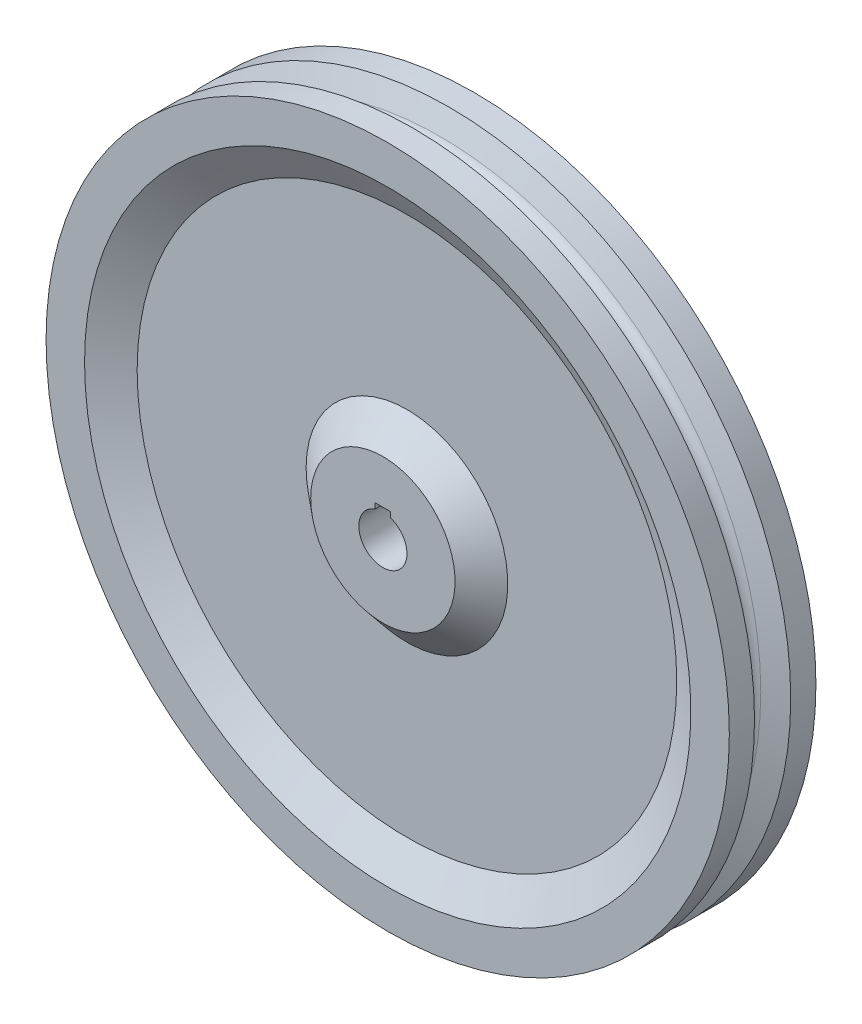
ISO-10303-21;
HEADER;
FILE_DESCRIPTION(('STEP AP214'),'2;1');
FILE_NAME('part.step','',(''),(''),'','','');
FILE_SCHEMA(('AUTOMOTIVE_DESIGN { 1 0 10303 214 1 1 1 1 }'));
ENDSEC;
DATA;
#1=APPLICATION_CONTEXT('core data for automotive mechanical design processes');
#2=APPLICATION_PROTOCOL_DEFINITION('international standard','automotive_design',2000,#1);
#3=PRODUCT_CONTEXT('',#1,'mechanical');
#4=PRODUCT('Part','Part','',(#3));
#5=PRODUCT_RELATED_PRODUCT_CATEGORY('part','',(#4));
#6=PRODUCT_DEFINITION_FORMATION('','',#4);
#7=PRODUCT_DEFINITION_CONTEXT('part definition',#1,'design');
#8=PRODUCT_DEFINITION('design','',#6,#7);
#9=PRODUCT_DEFINITION_SHAPE('','',#8);
#10=(LENGTH_UNIT() NAMED_UNIT(*) SI_UNIT(.MILLI.,.METRE.));
#11=(NAMED_UNIT(*) PLANE_ANGLE_UNIT() SI_UNIT($,.RADIAN.));
#12=(NAMED_UNIT(*) SI_UNIT($,.STERADIAN.) SOLID_ANGLE_UNIT());
#13=UNCERTAINTY_MEASURE_WITH_UNIT(LENGTH_MEASURE(1.E-05),#10,'distance_accuracy_value','');
#14=(GEOMETRIC_REPRESENTATION_CONTEXT(3) GLOBAL_UNCERTAINTY_ASSIGNED_CONTEXT((#13)) GLOBAL_UNIT_ASSIGNED_CONTEXT((#10,
#11,#12)) REPRESENTATION_CONTEXT('',''));
#15=CARTESIAN_POINT('',(0.,0.,0.));
#16=DIRECTION('',(0.,0.,1.));
#17=DIRECTION('',(1.,0.,0.));
#18=AXIS2_PLACEMENT_3D('',#15,#16,#17);
#19=CARTESIAN_POINT('',(0.,-0.00424506994476095,0.));
#20=DIRECTION('',(0.,0.,-1.));
#21=DIRECTION('',(-1.,0.,0.));
#22=AXIS2_PLACEMENT_3D('',#19,#20,#21);
#23=TOROIDAL_SURFACE('',#22,168.5,5.25000000000001);
#24=CARTESIAN_POINT('',(0.,-0.00424506994476095,4.85036754568427));
#25=DIRECTION('',(0.,0.,-1.));
#26=DIRECTION('',(-1.,0.,0.));
#27=AXIS2_PLACEMENT_3D('',#24,#25,#26);
#28=CIRCLE('',#27,166.490911980083);
#29=CARTESIAN_POINT('',(-166.490911980083,-0.00424506994476095,4.85036754568427));
#30=VERTEX_POINT('',#29);
#31=EDGE_CURVE('E148',#30,#30,#28,.T.);
#32=ORIENTED_EDGE('',*,*,#31,.T.);
#33=EDGE_LOOP('',(#32));
#34=FACE_BOUND('',#33,.T.);
#35=CARTESIAN_POINT('',(0.,-0.00424506994476095,-4.85036754568427));
#36=DIRECTION('',(0.,0.,-1.));
#37=DIRECTION('',(-1.,0.,0.));
#38=AXIS2_PLACEMENT_3D('',#35,#36,#37);
#39=CIRCLE('',#38,166.490911980083);
#40=CARTESIAN_POINT('',(-166.490911980083,-0.00424506994476095,-4.85036754568427));
#41=VERTEX_POINT('',#40);
#42=EDGE_CURVE('E127',#41,#41,#39,.T.);
#43=ORIENTED_EDGE('',*,*,#42,.F.);
#44=EDGE_LOOP('',(#43));
#45=FACE_BOUND('',#44,.T.);
#46=ADVANCED_FACE('F38',(#34,#45),#23,.F.);
#47=CARTESIAN_POINT('',(0.,-0.00424506994476095,4.85036754568427));
#48=DIRECTION('',(0.,0.,1.));
#49=DIRECTION('',(1.,0.,0.));
#50=AXIS2_PLACEMENT_3D('',#47,#48,#49);
#51=CONICAL_SURFACE('',#50,166.490911980083,1.17809724509617);
#52=CARTESIAN_POINT('',(0.,-0.00424506994476095,9.4104811128929));
#53=DIRECTION('',(0.,0.,-1.));
#54=DIRECTION('',(-1.,0.,0.));
#55=AXIS2_PLACEMENT_3D('',#52,#53,#54);
#56=CIRCLE('',#55,177.5);
#57=CARTESIAN_POINT('',(-177.5,-0.00424506994476095,9.4104811128929));
#58=VERTEX_POINT('',#57);
#59=EDGE_CURVE('E145',#58,#58,#56,.T.);
#60=ORIENTED_EDGE('',*,*,#59,.T.);
#61=EDGE_LOOP('',(#60));
#62=FACE_BOUND('',#61,.T.);
#63=ORIENTED_EDGE('',*,*,#31,.F.);
#64=EDGE_LOOP('',(#63));
#65=FACE_BOUND('',#64,.T.);
#66=ADVANCED_FACE('F167',(#62,#65),#51,.T.);
#67=CARTESIAN_POINT('',(0.,-0.00424506994476095,0.));
#68=DIRECTION('',(0.,0.,-1.));
#69=DIRECTION('',(-1.,0.,0.));
#70=AXIS2_PLACEMENT_3D('',#67,#68,#69);
#71=CYLINDRICAL_SURFACE('',#70,177.5);
#72=CARTESIAN_POINT('',(0.,-0.00424506994476095,22.5));
#73=DIRECTION('',(0.,0.,-1.));
#74=DIRECTION('',(-1.,0.,0.));
#75=AXIS2_PLACEMENT_3D('',#72,#73,#74);
#76=CIRCLE('',#75,177.5);
#77=CARTESIAN_POINT('',(-177.5,-0.00424506994476095,22.5));
#78=VERTEX_POINT('',#77);
#79=EDGE_CURVE('E142',#78,#78,#76,.T.);
#80=ORIENTED_EDGE('',*,*,#79,.T.);
#81=EDGE_LOOP('',(#80));
#82=FACE_BOUND('',#81,.T.);
#83=ORIENTED_EDGE('',*,*,#59,.F.);
#84=EDGE_LOOP('',(#83));
#85=FACE_BOUND('',#84,.T.);
#86=ADVANCED_FACE('F172',(#82,#85),#71,.T.);
#87=CARTESIAN_POINT('',(0.,157.495754930055,22.5));
#88=DIRECTION('',(0.,0.,1.));
#89=DIRECTION('',(1.,0.,0.));
#90=AXIS2_PLACEMENT_3D('',#87,#88,#89);
#91=PLANE('',#90);
#92=CARTESIAN_POINT('',(0.,-0.00424506994476095,22.5));
#93=DIRECTION('',(0.,0.,-1.));
#94=DIRECTION('',(-1.,0.,0.));
#95=AXIS2_PLACEMENT_3D('',#92,#93,#94);
#96=CIRCLE('',#95,157.5);
#97=CARTESIAN_POINT('',(-157.5,-0.00424506994476095,22.5));
#98=VERTEX_POINT('',#97);
#99=EDGE_CURVE('E139',#98,#98,#96,.T.);
#100=ORIENTED_EDGE('',*,*,#99,.T.);
#101=EDGE_LOOP('',(#100));
#102=FACE_BOUND('',#101,.T.);
#103=ORIENTED_EDGE('',*,*,#79,.F.);
#104=EDGE_LOOP('',(#103));
#105=FACE_BOUND('',#104,.T.);
#106=ADVANCED_FACE('F205',(#102,#105),#91,.T.);
#107=CARTESIAN_POINT('',(0.,-0.00424506994476095,22.5));
#108=DIRECTION('',(0.,0.,1.));
#109=DIRECTION('',(1.,0.,0.));
#110=AXIS2_PLACEMENT_3D('',#107,#108,#109);
#111=CONICAL_SURFACE('',#110,157.5,1.0471975511966);
#112=CARTESIAN_POINT('',(0.,-0.00424506994476095,12.5));
#113=DIRECTION('',(0.,0.,-1.));
#114=DIRECTION('',(-1.,0.,0.));
#115=AXIS2_PLACEMENT_3D('',#112,#113,#114);
#116=CIRCLE('',#115,140.179491924311);
#117=CARTESIAN_POINT('',(-140.179491924311,-0.00424506994476095,12.5));
#118=VERTEX_POINT('',#117);
#119=EDGE_CURVE('E136',#118,#118,#116,.T.);
#120=ORIENTED_EDGE('',*,*,#119,.T.);
#121=EDGE_LOOP('',(#120));
#122=FACE_BOUND('',#121,.T.);
#123=ORIENTED_EDGE('',*,*,#99,.F.);
#124=EDGE_LOOP('',(#123));
#125=FACE_BOUND('',#124,.T.);
#126=ADVANCED_FACE('F201',(#122,#125),#111,.F.);
#127=CARTESIAN_POINT('',(0.,52.3926748374828,12.5));
#128=DIRECTION('',(0.,0.,1.));
#129=DIRECTION('',(1.,0.,0.));
#130=AXIS2_PLACEMENT_3D('',#127,#128,#129);
#131=PLANE('',#130);
#132=CARTESIAN_POINT('',(0.,-0.00424506994476095,12.5));
#133=DIRECTION('',(0.,0.,-1.));
#134=DIRECTION('',(-1.,0.,0.));
#135=AXIS2_PLACEMENT_3D('',#132,#133,#134);
#136=CIRCLE('',#135,52.3969199074276);
#137=CARTESIAN_POINT('',(-52.3969199074276,-0.00424506994476095,12.5));
#138=VERTEX_POINT('',#137);
#139=EDGE_CURVE('E133',#138,#138,#136,.T.);
#140=ORIENTED_EDGE('',*,*,#139,.T.);
#141=EDGE_LOOP('',(#140));
#142=FACE_BOUND('',#141,.T.);
#143=ORIENTED_EDGE('',*,*,#119,.F.);
#144=EDGE_LOOP('',(#143));
#145=FACE_BOUND('',#144,.T.);
#146=ADVANCED_FACE('F197',(#142,#145),#131,.T.);
#147=CARTESIAN_POINT('',(0.,-0.00424506994476095,12.5));
#148=DIRECTION('',(0.,0.,-1.));
#149=DIRECTION('',(-1.,0.,0.));
#150=AXIS2_PLACEMENT_3D('',#147,#148,#149);
#151=CONICAL_SURFACE('',#150,52.3969199074276,0.872664625997163);
#152=CARTESIAN_POINT('',(0.,-0.00424506994476095,25.));
#153=DIRECTION('',(0.,0.,-1.));
#154=DIRECTION('',(-1.,0.,0.));
#155=AXIS2_PLACEMENT_3D('',#152,#153,#154);
#156=CIRCLE('',#155,37.5);
#157=CARTESIAN_POINT('',(-37.5,-0.00424506994476095,25.));
#158=VERTEX_POINT('',#157);
#159=EDGE_CURVE('E130',#158,#158,#156,.T.);
#160=ORIENTED_EDGE('',*,*,#159,.T.);
#161=EDGE_LOOP('',(#160));
#162=FACE_BOUND('',#161,.T.);
#163=ORIENTED_EDGE('',*,*,#139,.F.);
#164=EDGE_LOOP('',(#163));
#165=FACE_BOUND('',#164,.T.);
#166=ADVANCED_FACE('F190',(#162,#165),#151,.T.);
#167=CARTESIAN_POINT('',(0.,-0.00424506994476095,25.));
#168=DIRECTION('',(0.,0.,1.));
#169=DIRECTION('',(1.,0.,0.));
#170=AXIS2_PLACEMENT_3D('',#167,#168,#169);
#171=PLANE('',#170);
#172=DIRECTION('',(0.,-1.,0.));
#173=VECTOR('',#172,1.);
#174=CARTESIAN_POINT('',(-3.99999999999999,10.3457549300552,25.));
#175=LINE('',#174,#173);
#176=CARTESIAN_POINT('',(-3.99999999999999,14.6457549300552,25.));
#177=VERTEX_POINT('',#176);
#178=CARTESIAN_POINT('',(-3.99999999999998,11.8384742123822,25.));
#179=VERTEX_POINT('',#178);
#180=EDGE_CURVE('E100',#177,#179,#175,.T.);
#181=ORIENTED_EDGE('',*,*,#180,.F.);
#182=DIRECTION('',(-1.,0.,0.));
#183=VECTOR('',#182,1.);
#184=CARTESIAN_POINT('',(4.00000000000002,14.6457549300552,25.));
#185=LINE('',#184,#183);
#186=CARTESIAN_POINT('',(4.00000000000002,14.6457549300552,25.));
#187=VERTEX_POINT('',#186);
#188=EDGE_CURVE('E97',#187,#177,#185,.T.);
#189=ORIENTED_EDGE('',*,*,#188,.F.);
#190=DIRECTION('',(0.,1.,0.));
#191=VECTOR('',#190,1.);
#192=CARTESIAN_POINT('',(4.00000000000002,10.3457549300552,25.));
#193=LINE('',#192,#191);
#194=CARTESIAN_POINT('',(4.00000000000001,11.8384742123823,25.));
#195=VERTEX_POINT('',#194);
#196=EDGE_CURVE('E79',#195,#187,#193,.T.);
#197=ORIENTED_EDGE('',*,*,#196,.F.);
#198=CARTESIAN_POINT('',(0.,-0.00424506994476095,25.));
#199=DIRECTION('',(0.,0.,1.));
#200=DIRECTION('',(1.,0.,0.));
#201=AXIS2_PLACEMENT_3D('',#198,#199,#200);
#202=CIRCLE('',#201,12.5);
#203=EDGE_CURVE('E104',#179,#195,#202,.T.);
#204=ORIENTED_EDGE('',*,*,#203,.F.);
#205=EDGE_LOOP('',(#181,#189,#197,#204));
#206=FACE_BOUND('',#205,.T.);
#207=ORIENTED_EDGE('',*,*,#159,.F.);
#208=EDGE_LOOP('',(#207));
#209=FACE_BOUND('',#208,.T.);
#210=ADVANCED_FACE('F155',(#206,#209),#171,.T.);
#211=CARTESIAN_POINT('',(0.,-0.00424506994476095,-4.85036754568427));
#212=DIRECTION('',(0.,0.,-1.));
#213=DIRECTION('',(1.,0.,0.));
#214=AXIS2_PLACEMENT_3D('',#211,#212,#213);
#215=CONICAL_SURFACE('',#214,166.490911980083,1.17809724509617);
#216=CARTESIAN_POINT('',(0.,-0.00424506994476095,-9.4104811128929));
#217=DIRECTION('',(0.,0.,-1.));
#218=DIRECTION('',(-1.,0.,0.));
#219=AXIS2_PLACEMENT_3D('',#216,#217,#218);
#220=CIRCLE('',#219,177.5);
#221=CARTESIAN_POINT('',(-177.5,-0.00424506994476095,-9.4104811128929));
#222=VERTEX_POINT('',#221);
#223=EDGE_CURVE('E124',#222,#222,#220,.T.);
#224=ORIENTED_EDGE('',*,*,#223,.F.);
#225=EDGE_LOOP('',(#224));
#226=FACE_BOUND('',#225,.T.);
#227=ORIENTED_EDGE('',*,*,#42,.T.);
#228=EDGE_LOOP('',(#227));
#229=FACE_BOUND('',#228,.T.);
#230=ADVANCED_FACE('F178',(#226,#229),#215,.T.);
#231=CARTESIAN_POINT('',(0.,-0.00424506994476095,0.));
#232=DIRECTION('',(0.,0.,1.));
#233=DIRECTION('',(-1.,0.,0.));
#234=AXIS2_PLACEMENT_3D('',#231,#232,#233);
#235=CYLINDRICAL_SURFACE('',#234,177.5);
#236=CARTESIAN_POINT('',(0.,-0.00424506994476095,-22.5));
#237=DIRECTION('',(0.,0.,-1.));
#238=DIRECTION('',(-1.,0.,0.));
#239=AXIS2_PLACEMENT_3D('',#236,#237,#238);
#240=CIRCLE('',#239,177.5);
#241=CARTESIAN_POINT('',(-177.5,-0.00424506994476095,-22.5));
#242=VERTEX_POINT('',#241);
#243=EDGE_CURVE('E121',#242,#242,#240,.T.);
#244=ORIENTED_EDGE('',*,*,#243,.F.);
#245=EDGE_LOOP('',(#244));
#246=FACE_BOUND('',#245,.T.);
#247=ORIENTED_EDGE('',*,*,#223,.T.);
#248=EDGE_LOOP('',(#247));
#249=FACE_BOUND('',#248,.T.);
#250=ADVANCED_FACE('F180',(#246,#249),#235,.T.);
#251=CARTESIAN_POINT('',(0.,157.495754930055,-22.5));
#252=DIRECTION('',(0.,0.,-1.));
#253=DIRECTION('',(1.,0.,0.));
#254=AXIS2_PLACEMENT_3D('',#251,#252,#253);
#255=PLANE('',#254);
#256=CARTESIAN_POINT('',(0.,-0.00424506994476095,-22.5));
#257=DIRECTION('',(0.,0.,-1.));
#258=DIRECTION('',(-1.,0.,0.));
#259=AXIS2_PLACEMENT_3D('',#256,#257,#258);
#260=CIRCLE('',#259,157.5);
#261=CARTESIAN_POINT('',(-157.5,-0.00424506994476095,-22.5));
#262=VERTEX_POINT('',#261);
#263=EDGE_CURVE('E118',#262,#262,#260,.T.);
#264=ORIENTED_EDGE('',*,*,#263,.F.);
#265=EDGE_LOOP('',(#264));
#266=FACE_BOUND('',#265,.T.);
#267=ORIENTED_EDGE('',*,*,#243,.T.);
#268=EDGE_LOOP('',(#267));
#269=FACE_BOUND('',#268,.T.);
#270=ADVANCED_FACE('F187',(#266,#269),#255,.T.);
#271=CARTESIAN_POINT('',(0.,-0.00424506994476095,-22.5));
#272=DIRECTION('',(0.,0.,-1.));
#273=DIRECTION('',(1.,0.,0.));
#274=AXIS2_PLACEMENT_3D('',#271,#272,#273);
#275=CONICAL_SURFACE('',#274,157.5,1.0471975511966);
#276=CARTESIAN_POINT('',(0.,-0.00424506994476095,-12.5));
#277=DIRECTION('',(0.,0.,-1.));
#278=DIRECTION('',(-1.,0.,0.));
#279=AXIS2_PLACEMENT_3D('',#276,#277,#278);
#280=CIRCLE('',#279,140.179491924311);
#281=CARTESIAN_POINT('',(-140.179491924311,-0.00424506994476095,-12.5));
#282=VERTEX_POINT('',#281);
#283=EDGE_CURVE('E115',#282,#282,#280,.T.);
#284=ORIENTED_EDGE('',*,*,#283,.F.);
#285=EDGE_LOOP('',(#284));
#286=FACE_BOUND('',#285,.T.);
#287=ORIENTED_EDGE('',*,*,#263,.T.);
#288=EDGE_LOOP('',(#287));
#289=FACE_BOUND('',#288,.T.);
#290=ADVANCED_FACE('F261',(#286,#289),#275,.F.);
#291=CARTESIAN_POINT('',(0.,52.3926748374828,-12.5));
#292=DIRECTION('',(0.,0.,-1.));
#293=DIRECTION('',(1.,0.,0.));
#294=AXIS2_PLACEMENT_3D('',#291,#292,#293);
#295=PLANE('',#294);
#296=CARTESIAN_POINT('',(0.,-0.00424506994476095,-12.5));
#297=DIRECTION('',(0.,0.,-1.));
#298=DIRECTION('',(-1.,0.,0.));
#299=AXIS2_PLACEMENT_3D('',#296,#297,#298);
#300=CIRCLE('',#299,52.3969199074276);
#301=CARTESIAN_POINT('',(-52.3969199074276,-0.00424506994476095,-12.5));
#302=VERTEX_POINT('',#301);
#303=EDGE_CURVE('E112',#302,#302,#300,.T.);
#304=ORIENTED_EDGE('',*,*,#303,.F.);
#305=EDGE_LOOP('',(#304));
#306=FACE_BOUND('',#305,.T.);
#307=ORIENTED_EDGE('',*,*,#283,.T.);
#308=EDGE_LOOP('',(#307));
#309=FACE_BOUND('',#308,.T.);
#310=ADVANCED_FACE('F270',(#306,#309),#295,.T.);
#311=CARTESIAN_POINT('',(0.,-0.00424506994476095,-12.5));
#312=DIRECTION('',(0.,0.,1.));
#313=DIRECTION('',(-1.,0.,0.));
#314=AXIS2_PLACEMENT_3D('',#311,#312,#313);
#315=CONICAL_SURFACE('',#314,52.3969199074276,0.872664625997163);
#316=CARTESIAN_POINT('',(0.,-0.00424506994476095,-25.));
#317=DIRECTION('',(0.,0.,-1.));
#318=DIRECTION('',(-1.,0.,0.));
#319=AXIS2_PLACEMENT_3D('',#316,#317,#318);
#320=CIRCLE('',#319,37.5);
#321=CARTESIAN_POINT('',(-37.5,-0.00424506994476095,-25.));
#322=VERTEX_POINT('',#321);
#323=EDGE_CURVE('E107',#322,#322,#320,.T.);
#324=ORIENTED_EDGE('',*,*,#323,.F.);
#325=EDGE_LOOP('',(#324));
#326=FACE_BOUND('',#325,.T.);
#327=ORIENTED_EDGE('',*,*,#303,.T.);
#328=EDGE_LOOP('',(#327));
#329=FACE_BOUND('',#328,.T.);
#330=ADVANCED_FACE('F280',(#326,#329),#315,.T.);
#331=CARTESIAN_POINT('',(0.,-0.00424506994476095,-25.));
#332=DIRECTION('',(0.,0.,-1.));
#333=DIRECTION('',(1.,0.,0.));
#334=AXIS2_PLACEMENT_3D('',#331,#332,#333);
#335=PLANE('',#334);
#336=DIRECTION('',(0.,-1.,0.));
#337=VECTOR('',#336,1.);
#338=CARTESIAN_POINT('',(-3.99999999999999,10.3457549300552,-25.));
#339=LINE('',#338,#337);
#340=CARTESIAN_POINT('',(-3.99999999999999,14.6457549300552,-25.));
#341=VERTEX_POINT('',#340);
#342=CARTESIAN_POINT('',(-3.99999999999998,11.8384742123822,-25.));
#343=VERTEX_POINT('',#342);
#344=EDGE_CURVE('E95',#341,#343,#339,.T.);
#345=ORIENTED_EDGE('',*,*,#344,.T.);
#346=CARTESIAN_POINT('',(0.,-0.00424506994476095,-25.));
#347=DIRECTION('',(0.,0.,1.));
#348=DIRECTION('',(1.,0.,0.));
#349=AXIS2_PLACEMENT_3D('',#346,#347,#348);
#350=CIRCLE('',#349,12.5);
#351=CARTESIAN_POINT('',(4.00000000000001,11.8384742123823,-25.));
#352=VERTEX_POINT('',#351);
#353=EDGE_CURVE('E94',#343,#352,#350,.T.);
#354=ORIENTED_EDGE('',*,*,#353,.T.);
#355=DIRECTION('',(0.,1.,0.));
#356=VECTOR('',#355,1.);
#357=CARTESIAN_POINT('',(4.00000000000002,10.3457549300552,-25.));
#358=LINE('',#357,#356);
#359=CARTESIAN_POINT('',(4.00000000000002,14.6457549300552,-25.));
#360=VERTEX_POINT('',#359);
#361=EDGE_CURVE('E52',#352,#360,#358,.T.);
#362=ORIENTED_EDGE('',*,*,#361,.T.);
#363=DIRECTION('',(-1.,0.,0.));
#364=VECTOR('',#363,1.);
#365=CARTESIAN_POINT('',(4.00000000000002,14.6457549300552,-25.));
#366=LINE('',#365,#364);
#367=EDGE_CURVE('E84',#360,#341,#366,.T.);
#368=ORIENTED_EDGE('',*,*,#367,.T.);
#369=EDGE_LOOP('',(#345,#354,#362,#368));
#370=FACE_BOUND('',#369,.T.);
#371=ORIENTED_EDGE('',*,*,#323,.T.);
#372=EDGE_LOOP('',(#371));
#373=FACE_BOUND('',#372,.T.);
#374=ADVANCED_FACE('F91',(#370,#373),#335,.T.);
#375=CARTESIAN_POINT('',(0.,-0.00424506994476095,-25.));
#376=DIRECTION('',(0.,0.,1.));
#377=DIRECTION('',(1.,0.,0.));
#378=AXIS2_PLACEMENT_3D('',#375,#376,#377);
#379=CYLINDRICAL_SURFACE('',#378,12.5);
#380=ORIENTED_EDGE('',*,*,#353,.F.);
#381=DIRECTION('',(0.,0.,1.));
#382=VECTOR('',#381,1.);
#383=CARTESIAN_POINT('',(-3.99999999999998,11.8384742123822,-25.));
#384=LINE('',#383,#382);
#385=EDGE_CURVE('E11',#343,#179,#384,.T.);
#386=ORIENTED_EDGE('',*,*,#385,.T.);
#387=ORIENTED_EDGE('',*,*,#203,.T.);
#388=DIRECTION('',(0.,0.,1.));
#389=VECTOR('',#388,1.);
#390=CARTESIAN_POINT('',(4.00000000000001,11.8384742123823,-25.));
#391=LINE('',#390,#389);
#392=EDGE_CURVE('E45',#195,#352,#391,.F.);
#393=ORIENTED_EDGE('',*,*,#392,.T.);
#394=EDGE_LOOP('',(#380,#386,#387,#393));
#395=FACE_BOUND('',#394,.T.);
#396=ADVANCED_FACE('F151',(#395),#379,.F.);
#397=CARTESIAN_POINT('',(-3.99999999999999,10.3457549300552,-25.));
#398=DIRECTION('',(-1.,0.,0.));
#399=DIRECTION('',(0.,0.,1.));
#400=AXIS2_PLACEMENT_3D('',#397,#398,#399);
#401=PLANE('',#400);
#402=ORIENTED_EDGE('',*,*,#344,.F.);
#403=DIRECTION('',(0.,0.,1.));
#404=VECTOR('',#403,1.);
#405=CARTESIAN_POINT('',(-3.99999999999999,14.6457549300552,-25.));
#406=LINE('',#405,#404);
#407=EDGE_CURVE('E83',#341,#177,#406,.T.);
#408=ORIENTED_EDGE('',*,*,#407,.T.);
#409=ORIENTED_EDGE('',*,*,#180,.T.);
#410=ORIENTED_EDGE('',*,*,#385,.F.);
#411=EDGE_LOOP('',(#402,#408,#409,#410));
#412=FACE_BOUND('',#411,.T.);
#413=ADVANCED_FACE('F157',(#412),#401,.F.);
#414=CARTESIAN_POINT('',(4.00000000000002,10.3457549300552,-25.));
#415=DIRECTION('',(1.,0.,0.));
#416=DIRECTION('',(0.,0.,-1.));
#417=AXIS2_PLACEMENT_3D('',#414,#415,#416);
#418=PLANE('',#417);
#419=ORIENTED_EDGE('',*,*,#196,.T.);
#420=DIRECTION('',(0.,0.,1.));
#421=VECTOR('',#420,1.);
#422=CARTESIAN_POINT('',(4.00000000000002,14.6457549300552,-25.));
#423=LINE('',#422,#421);
#424=EDGE_CURVE('E75',#360,#187,#423,.T.);
#425=ORIENTED_EDGE('',*,*,#424,.F.);
#426=ORIENTED_EDGE('',*,*,#361,.F.);
#427=ORIENTED_EDGE('',*,*,#392,.F.);
#428=EDGE_LOOP('',(#419,#425,#426,#427));
#429=FACE_BOUND('',#428,.T.);
#430=ADVANCED_FACE('F77',(#429),#418,.F.);
#431=CARTESIAN_POINT('',(4.00000000000002,14.6457549300552,-25.));
#432=DIRECTION('',(0.,1.,0.));
#433=DIRECTION('',(-1.,0.,0.));
#434=AXIS2_PLACEMENT_3D('',#431,#432,#433);
#435=PLANE('',#434);
#436=ORIENTED_EDGE('',*,*,#188,.T.);
#437=ORIENTED_EDGE('',*,*,#407,.F.);
#438=ORIENTED_EDGE('',*,*,#367,.F.);
#439=ORIENTED_EDGE('',*,*,#424,.T.);
#440=EDGE_LOOP('',(#436,#437,#438,#439));
#441=FACE_BOUND('',#440,.T.);
#442=ADVANCED_FACE('F87',(#441),#435,.F.);
#443=CLOSED_SHELL('',(#46,#66,#86,#106,#126,#146,#166,#210,#230,#250,#270,#290,#310,#330,#374,
#396,#413,#430,#442));
#444=MANIFOLD_SOLID_BREP('B2',#443);
#445=ADVANCED_BREP_SHAPE_REPRESENTATION('',(#18,#444),#14);
#446=SHAPE_DEFINITION_REPRESENTATION(#9,#445);
ENDSEC;
END-ISO-10303-21;
